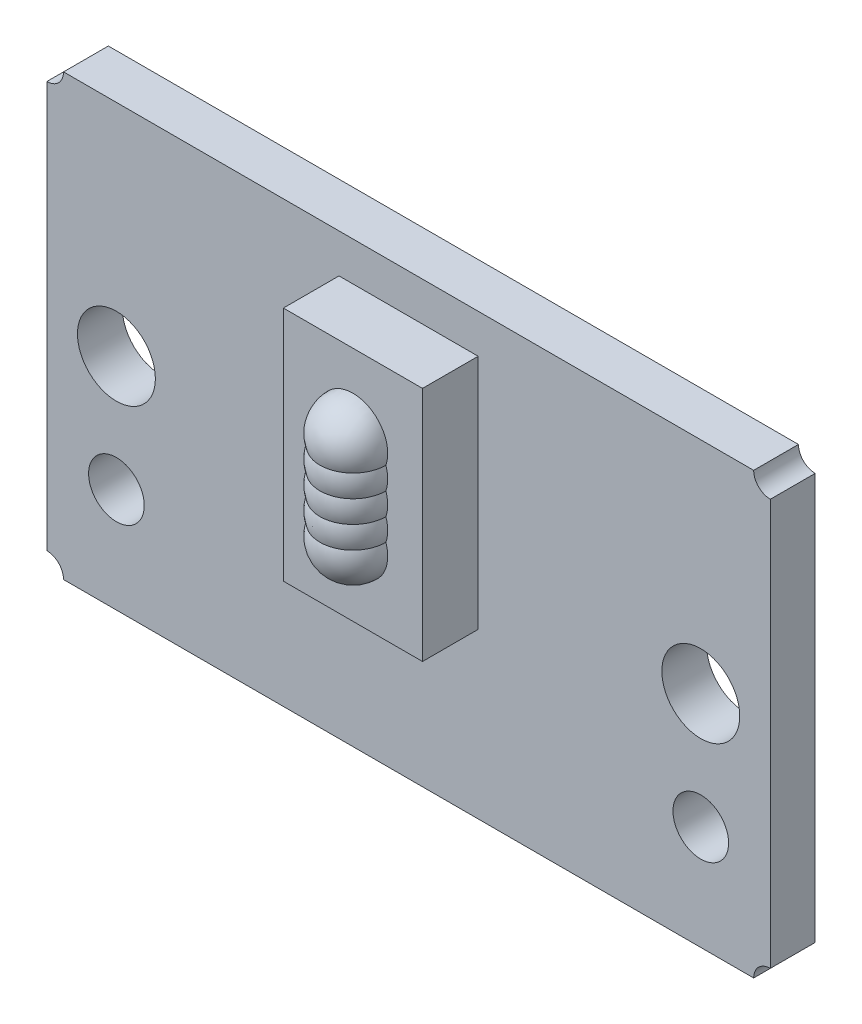
ISO-10303-21;
HEADER;
FILE_DESCRIPTION(('STEP AP214'),'2;1');
FILE_NAME('part.step','',(''),(''),'','','');
FILE_SCHEMA(('AUTOMOTIVE_DESIGN { 1 0 10303 214 1 1 1 1 }'));
ENDSEC;
DATA;
#1=APPLICATION_CONTEXT('core data for automotive mechanical design processes');
#2=APPLICATION_PROTOCOL_DEFINITION('international standard','automotive_design',2000,#1);
#3=PRODUCT_CONTEXT('',#1,'mechanical');
#4=PRODUCT('Part','Part','',(#3));
#5=PRODUCT_RELATED_PRODUCT_CATEGORY('part','',(#4));
#6=PRODUCT_DEFINITION_FORMATION('','',#4);
#7=PRODUCT_DEFINITION_CONTEXT('part definition',#1,'design');
#8=PRODUCT_DEFINITION('design','',#6,#7);
#9=PRODUCT_DEFINITION_SHAPE('','',#8);
#10=(LENGTH_UNIT() NAMED_UNIT(*) SI_UNIT(.MILLI.,.METRE.));
#11=(NAMED_UNIT(*) PLANE_ANGLE_UNIT() SI_UNIT($,.RADIAN.));
#12=(NAMED_UNIT(*) SI_UNIT($,.STERADIAN.) SOLID_ANGLE_UNIT());
#13=UNCERTAINTY_MEASURE_WITH_UNIT(LENGTH_MEASURE(1.E-05),#10,'distance_accuracy_value','');
#14=(GEOMETRIC_REPRESENTATION_CONTEXT(3) GLOBAL_UNCERTAINTY_ASSIGNED_CONTEXT((#13)) GLOBAL_UNIT_ASSIGNED_CONTEXT((#10,
#11,#12)) REPRESENTATION_CONTEXT('',''));
#15=CARTESIAN_POINT('',(0.,0.,0.));
#16=DIRECTION('',(0.,0.,1.));
#17=DIRECTION('',(1.,0.,0.));
#18=AXIS2_PLACEMENT_3D('',#15,#16,#17);
#19=CARTESIAN_POINT('',(0.,0.,1.61));
#20=DIRECTION('',(0.,0.,1.));
#21=DIRECTION('',(1.,0.,0.));
#22=AXIS2_PLACEMENT_3D('',#19,#20,#21);
#23=PLANE('',#22);
#24=CARTESIAN_POINT('',(10.5,0.,1.61));
#25=DIRECTION('',(0.,0.,1.));
#26=DIRECTION('',(1.,0.,0.));
#27=AXIS2_PLACEMENT_3D('',#24,#25,#26);
#28=CIRCLE('',#27,1.4);
#29=CARTESIAN_POINT('',(11.9,0.,1.61));
#30=VERTEX_POINT('',#29);
#31=EDGE_CURVE('E313',#30,#30,#28,.T.);
#32=ORIENTED_EDGE('',*,*,#31,.F.);
#33=EDGE_LOOP('',(#32));
#34=FACE_BOUND('',#33,.T.);
#35=CARTESIAN_POINT('',(-10.5,-4.15,1.61));
#36=DIRECTION('',(0.,0.,1.));
#37=DIRECTION('',(1.,0.,0.));
#38=AXIS2_PLACEMENT_3D('',#35,#36,#37);
#39=CIRCLE('',#38,1.);
#40=CARTESIAN_POINT('',(-9.5,-4.15,1.61));
#41=VERTEX_POINT('',#40);
#42=EDGE_CURVE('E312',#41,#41,#39,.T.);
#43=ORIENTED_EDGE('',*,*,#42,.F.);
#44=EDGE_LOOP('',(#43));
#45=FACE_BOUND('',#44,.T.);
#46=CARTESIAN_POINT('',(10.5,-4.15,1.61));
#47=DIRECTION('',(0.,0.,1.));
#48=DIRECTION('',(1.,0.,0.));
#49=AXIS2_PLACEMENT_3D('',#46,#47,#48);
#50=CIRCLE('',#49,1.);
#51=CARTESIAN_POINT('',(11.5,-4.15,1.61));
#52=VERTEX_POINT('',#51);
#53=EDGE_CURVE('E309',#52,#52,#50,.T.);
#54=ORIENTED_EDGE('',*,*,#53,.F.);
#55=EDGE_LOOP('',(#54));
#56=FACE_BOUND('',#55,.T.);
#57=CARTESIAN_POINT('',(-10.5,0.,1.61));
#58=DIRECTION('',(0.,0.,1.));
#59=DIRECTION('',(1.,0.,0.));
#60=AXIS2_PLACEMENT_3D('',#57,#58,#59);
#61=CIRCLE('',#60,1.4);
#62=CARTESIAN_POINT('',(-9.1,0.,1.61));
#63=VERTEX_POINT('',#62);
#64=EDGE_CURVE('E250',#63,#63,#61,.T.);
#65=ORIENTED_EDGE('',*,*,#64,.F.);
#66=EDGE_LOOP('',(#65));
#67=FACE_BOUND('',#66,.T.);
#68=CARTESIAN_POINT('',(13.,7.9,1.61));
#69=DIRECTION('',(0.,0.,1.));
#70=DIRECTION('',(1.,0.,0.));
#71=AXIS2_PLACEMENT_3D('',#68,#69,#70);
#72=CIRCLE('',#71,0.6);
#73=CARTESIAN_POINT('',(12.4,7.9,1.61));
#74=VERTEX_POINT('',#73);
#75=CARTESIAN_POINT('',(13.,7.3,1.61));
#76=VERTEX_POINT('',#75);
#77=EDGE_CURVE('E331',#74,#76,#72,.T.);
#78=ORIENTED_EDGE('',*,*,#77,.F.);
#79=DIRECTION('',(-1.,0.,0.));
#80=VECTOR('',#79,1.);
#81=CARTESIAN_POINT('',(-13.,7.9,1.61));
#82=LINE('',#81,#80);
#83=CARTESIAN_POINT('',(-12.4,7.9,1.61));
#84=VERTEX_POINT('',#83);
#85=EDGE_CURVE('E210',#74,#84,#82,.T.);
#86=ORIENTED_EDGE('',*,*,#85,.T.);
#87=CARTESIAN_POINT('',(-13.,7.9,1.61));
#88=DIRECTION('',(0.,0.,1.));
#89=DIRECTION('',(1.,0.,0.));
#90=AXIS2_PLACEMENT_3D('',#87,#88,#89);
#91=CIRCLE('',#90,0.6);
#92=CARTESIAN_POINT('',(-13.,7.3,1.61));
#93=VERTEX_POINT('',#92);
#94=EDGE_CURVE('E322',#93,#84,#91,.T.);
#95=ORIENTED_EDGE('',*,*,#94,.F.);
#96=DIRECTION('',(0.,-1.,0.));
#97=VECTOR('',#96,1.);
#98=CARTESIAN_POINT('',(-13.,7.9,1.61));
#99=LINE('',#98,#97);
#100=CARTESIAN_POINT('',(-13.,-7.3,1.61));
#101=VERTEX_POINT('',#100);
#102=EDGE_CURVE('E218',#93,#101,#99,.T.);
#103=ORIENTED_EDGE('',*,*,#102,.T.);
#104=CARTESIAN_POINT('',(-13.,-7.9,1.61));
#105=DIRECTION('',(0.,0.,1.));
#106=DIRECTION('',(1.,0.,0.));
#107=AXIS2_PLACEMENT_3D('',#104,#105,#106);
#108=CIRCLE('',#107,0.6);
#109=CARTESIAN_POINT('',(-12.4,-7.9,1.61));
#110=VERTEX_POINT('',#109);
#111=EDGE_CURVE('E320',#110,#101,#108,.T.);
#112=ORIENTED_EDGE('',*,*,#111,.F.);
#113=DIRECTION('',(1.,0.,0.));
#114=VECTOR('',#113,1.);
#115=CARTESIAN_POINT('',(-13.,-7.9,1.61));
#116=LINE('',#115,#114);
#117=CARTESIAN_POINT('',(12.4,-7.9,1.61));
#118=VERTEX_POINT('',#117);
#119=EDGE_CURVE('E222',#110,#118,#116,.T.);
#120=ORIENTED_EDGE('',*,*,#119,.T.);
#121=CARTESIAN_POINT('',(13.,-7.9,1.61));
#122=DIRECTION('',(0.,0.,1.));
#123=DIRECTION('',(1.,0.,0.));
#124=AXIS2_PLACEMENT_3D('',#121,#122,#123);
#125=CIRCLE('',#124,0.6);
#126=CARTESIAN_POINT('',(13.,-7.3,1.61));
#127=VERTEX_POINT('',#126);
#128=EDGE_CURVE('E326',#127,#118,#125,.T.);
#129=ORIENTED_EDGE('',*,*,#128,.F.);
#130=DIRECTION('',(0.,1.,0.));
#131=VECTOR('',#130,1.);
#132=CARTESIAN_POINT('',(13.,7.9,1.61));
#133=LINE('',#132,#131);
#134=EDGE_CURVE('E219',#127,#76,#133,.T.);
#135=ORIENTED_EDGE('',*,*,#134,.T.);
#136=EDGE_LOOP('',(#78,#86,#95,#103,#112,#120,#129,#135));
#137=FACE_BOUND('',#136,.T.);
#138=DIRECTION('',(-1.,0.,0.));
#139=VECTOR('',#138,1.);
#140=CARTESIAN_POINT('',(-2.5,6.5,1.61));
#141=LINE('',#140,#139);
#142=CARTESIAN_POINT('',(2.5,6.5,1.61));
#143=VERTEX_POINT('',#142);
#144=CARTESIAN_POINT('',(-2.5,6.5,1.61));
#145=VERTEX_POINT('',#144);
#146=EDGE_CURVE('E294',#143,#145,#141,.T.);
#147=ORIENTED_EDGE('',*,*,#146,.F.);
#148=DIRECTION('',(0.,1.,0.));
#149=VECTOR('',#148,1.);
#150=CARTESIAN_POINT('',(2.5,6.5,1.61));
#151=LINE('',#150,#149);
#152=CARTESIAN_POINT('',(2.5,-2.,1.61));
#153=VERTEX_POINT('',#152);
#154=EDGE_CURVE('E278',#153,#143,#151,.T.);
#155=ORIENTED_EDGE('',*,*,#154,.F.);
#156=DIRECTION('',(1.,0.,0.));
#157=VECTOR('',#156,1.);
#158=CARTESIAN_POINT('',(-2.5,-2.,1.61));
#159=LINE('',#158,#157);
#160=CARTESIAN_POINT('',(-2.5,-2.,1.61));
#161=VERTEX_POINT('',#160);
#162=EDGE_CURVE('E285',#161,#153,#159,.T.);
#163=ORIENTED_EDGE('',*,*,#162,.F.);
#164=DIRECTION('',(0.,-1.,0.));
#165=VECTOR('',#164,1.);
#166=CARTESIAN_POINT('',(-2.5,6.5,1.61));
#167=LINE('',#166,#165);
#168=EDGE_CURVE('E296',#145,#161,#167,.T.);
#169=ORIENTED_EDGE('',*,*,#168,.F.);
#170=EDGE_LOOP('',(#147,#155,#163,#169));
#171=FACE_BOUND('',#170,.T.);
#172=ADVANCED_FACE('F45',(#34,#45,#56,#67,#137,#171),#23,.T.);
#173=CARTESIAN_POINT('',(13.,7.9,1.61));
#174=DIRECTION('',(-1.,0.,0.));
#175=DIRECTION('',(0.,-1.,0.));
#176=AXIS2_PLACEMENT_3D('',#173,#174,#175);
#177=PLANE('',#176);
#178=DIRECTION('',(0.,1.,0.));
#179=VECTOR('',#178,1.);
#180=CARTESIAN_POINT('',(13.,7.9,0.));
#181=LINE('',#180,#179);
#182=CARTESIAN_POINT('',(13.,-7.3,0.));
#183=VERTEX_POINT('',#182);
#184=CARTESIAN_POINT('',(13.,7.3,0.));
#185=VERTEX_POINT('',#184);
#186=EDGE_CURVE('E232',#183,#185,#181,.T.);
#187=ORIENTED_EDGE('',*,*,#186,.T.);
#188=DIRECTION('',(0.,0.,1.));
#189=VECTOR('',#188,1.);
#190=CARTESIAN_POINT('',(13.,7.3,0.));
#191=LINE('',#190,#189);
#192=EDGE_CURVE('E236',#185,#76,#191,.T.);
#193=ORIENTED_EDGE('',*,*,#192,.T.);
#194=ORIENTED_EDGE('',*,*,#134,.F.);
#195=DIRECTION('',(0.,0.,1.));
#196=VECTOR('',#195,1.);
#197=CARTESIAN_POINT('',(13.,-7.3,0.));
#198=LINE('',#197,#196);
#199=EDGE_CURVE('E349',#127,#183,#198,.F.);
#200=ORIENTED_EDGE('',*,*,#199,.T.);
#201=EDGE_LOOP('',(#187,#193,#194,#200));
#202=FACE_BOUND('',#201,.T.);
#203=ADVANCED_FACE('F47',(#202),#177,.F.);
#204=CARTESIAN_POINT('',(-13.,7.9,1.61));
#205=DIRECTION('',(0.,-1.,0.));
#206=DIRECTION('',(0.,0.,-1.));
#207=AXIS2_PLACEMENT_3D('',#204,#205,#206);
#208=PLANE('',#207);
#209=ORIENTED_EDGE('',*,*,#85,.F.);
#210=DIRECTION('',(0.,0.,1.));
#211=VECTOR('',#210,1.);
#212=CARTESIAN_POINT('',(12.4,7.9,0.));
#213=LINE('',#212,#211);
#214=CARTESIAN_POINT('',(12.4,7.9,0.));
#215=VERTEX_POINT('',#214);
#216=EDGE_CURVE('E212',#74,#215,#213,.F.);
#217=ORIENTED_EDGE('',*,*,#216,.T.);
#218=DIRECTION('',(-1.,0.,0.));
#219=VECTOR('',#218,1.);
#220=CARTESIAN_POINT('',(-13.,7.9,0.));
#221=LINE('',#220,#219);
#222=CARTESIAN_POINT('',(-12.4,7.9,0.));
#223=VERTEX_POINT('',#222);
#224=EDGE_CURVE('E235',#215,#223,#221,.T.);
#225=ORIENTED_EDGE('',*,*,#224,.T.);
#226=DIRECTION('',(0.,0.,1.));
#227=VECTOR('',#226,1.);
#228=CARTESIAN_POINT('',(-12.4,7.9,0.));
#229=LINE('',#228,#227);
#230=EDGE_CURVE('E214',#223,#84,#229,.T.);
#231=ORIENTED_EDGE('',*,*,#230,.T.);
#232=EDGE_LOOP('',(#209,#217,#225,#231));
#233=FACE_BOUND('',#232,.T.);
#234=ADVANCED_FACE('F183',(#233),#208,.F.);
#235=CARTESIAN_POINT('',(-13.,7.9,1.61));
#236=DIRECTION('',(1.,0.,0.));
#237=DIRECTION('',(0.,1.,0.));
#238=AXIS2_PLACEMENT_3D('',#235,#236,#237);
#239=PLANE('',#238);
#240=DIRECTION('',(0.,-1.,0.));
#241=VECTOR('',#240,1.);
#242=CARTESIAN_POINT('',(-13.,7.9,0.));
#243=LINE('',#242,#241);
#244=CARTESIAN_POINT('',(-13.,7.3,0.));
#245=VERTEX_POINT('',#244);
#246=CARTESIAN_POINT('',(-13.,-7.3,0.));
#247=VERTEX_POINT('',#246);
#248=EDGE_CURVE('E238',#245,#247,#243,.T.);
#249=ORIENTED_EDGE('',*,*,#248,.T.);
#250=DIRECTION('',(0.,0.,1.));
#251=VECTOR('',#250,1.);
#252=CARTESIAN_POINT('',(-13.,-7.3,0.));
#253=LINE('',#252,#251);
#254=EDGE_CURVE('E343',#247,#101,#253,.T.);
#255=ORIENTED_EDGE('',*,*,#254,.T.);
#256=ORIENTED_EDGE('',*,*,#102,.F.);
#257=DIRECTION('',(0.,0.,1.));
#258=VECTOR('',#257,1.);
#259=CARTESIAN_POINT('',(-13.,7.3,0.));
#260=LINE('',#259,#258);
#261=EDGE_CURVE('E336',#93,#245,#260,.F.);
#262=ORIENTED_EDGE('',*,*,#261,.T.);
#263=EDGE_LOOP('',(#249,#255,#256,#262));
#264=FACE_BOUND('',#263,.T.);
#265=ADVANCED_FACE('F198',(#264),#239,.F.);
#266=CARTESIAN_POINT('',(-13.,-7.9,1.61));
#267=DIRECTION('',(0.,1.,0.));
#268=DIRECTION('',(0.,0.,1.));
#269=AXIS2_PLACEMENT_3D('',#266,#267,#268);
#270=PLANE('',#269);
#271=DIRECTION('',(1.,0.,0.));
#272=VECTOR('',#271,1.);
#273=CARTESIAN_POINT('',(-13.,-7.9,0.));
#274=LINE('',#273,#272);
#275=CARTESIAN_POINT('',(-12.4,-7.9,0.));
#276=VERTEX_POINT('',#275);
#277=CARTESIAN_POINT('',(12.4,-7.9,0.));
#278=VERTEX_POINT('',#277);
#279=EDGE_CURVE('E225',#276,#278,#274,.T.);
#280=ORIENTED_EDGE('',*,*,#279,.T.);
#281=DIRECTION('',(0.,0.,1.));
#282=VECTOR('',#281,1.);
#283=CARTESIAN_POINT('',(12.4,-7.9,0.));
#284=LINE('',#283,#282);
#285=EDGE_CURVE('E346',#278,#118,#284,.T.);
#286=ORIENTED_EDGE('',*,*,#285,.T.);
#287=ORIENTED_EDGE('',*,*,#119,.F.);
#288=DIRECTION('',(0.,0.,1.));
#289=VECTOR('',#288,1.);
#290=CARTESIAN_POINT('',(-12.4,-7.9,0.));
#291=LINE('',#290,#289);
#292=EDGE_CURVE('E340',#110,#276,#291,.F.);
#293=ORIENTED_EDGE('',*,*,#292,.T.);
#294=EDGE_LOOP('',(#280,#286,#287,#293));
#295=FACE_BOUND('',#294,.T.);
#296=ADVANCED_FACE('F194',(#295),#270,.F.);
#297=CARTESIAN_POINT('',(0.,0.,0.));
#298=DIRECTION('',(0.,0.,1.));
#299=DIRECTION('',(1.,0.,0.));
#300=AXIS2_PLACEMENT_3D('',#297,#298,#299);
#301=PLANE('',#300);
#302=CARTESIAN_POINT('',(10.5,0.,0.));
#303=DIRECTION('',(0.,0.,1.));
#304=DIRECTION('',(1.,0.,0.));
#305=AXIS2_PLACEMENT_3D('',#302,#303,#304);
#306=CIRCLE('',#305,1.4);
#307=CARTESIAN_POINT('',(11.9,0.,0.));
#308=VERTEX_POINT('',#307);
#309=EDGE_CURVE('E256',#308,#308,#306,.T.);
#310=ORIENTED_EDGE('',*,*,#309,.T.);
#311=EDGE_LOOP('',(#310));
#312=FACE_BOUND('',#311,.T.);
#313=CARTESIAN_POINT('',(-10.5,-4.15,0.));
#314=DIRECTION('',(0.,0.,1.));
#315=DIRECTION('',(1.,0.,0.));
#316=AXIS2_PLACEMENT_3D('',#313,#314,#315);
#317=CIRCLE('',#316,1.);
#318=CARTESIAN_POINT('',(-9.5,-4.15,0.));
#319=VERTEX_POINT('',#318);
#320=EDGE_CURVE('E253',#319,#319,#317,.T.);
#321=ORIENTED_EDGE('',*,*,#320,.T.);
#322=EDGE_LOOP('',(#321));
#323=FACE_BOUND('',#322,.T.);
#324=CARTESIAN_POINT('',(10.5,-4.15,0.));
#325=DIRECTION('',(0.,0.,1.));
#326=DIRECTION('',(1.,0.,0.));
#327=AXIS2_PLACEMENT_3D('',#324,#325,#326);
#328=CIRCLE('',#327,1.);
#329=CARTESIAN_POINT('',(11.5,-4.15,0.));
#330=VERTEX_POINT('',#329);
#331=EDGE_CURVE('E249',#330,#330,#328,.T.);
#332=ORIENTED_EDGE('',*,*,#331,.T.);
#333=EDGE_LOOP('',(#332));
#334=FACE_BOUND('',#333,.T.);
#335=CARTESIAN_POINT('',(-10.5,0.,0.));
#336=DIRECTION('',(0.,0.,1.));
#337=DIRECTION('',(1.,0.,0.));
#338=AXIS2_PLACEMENT_3D('',#335,#336,#337);
#339=CIRCLE('',#338,1.4);
#340=CARTESIAN_POINT('',(-9.1,0.,0.));
#341=VERTEX_POINT('',#340);
#342=EDGE_CURVE('E246',#341,#341,#339,.T.);
#343=ORIENTED_EDGE('',*,*,#342,.T.);
#344=EDGE_LOOP('',(#343));
#345=FACE_BOUND('',#344,.T.);
#346=ORIENTED_EDGE('',*,*,#224,.F.);
#347=CARTESIAN_POINT('',(13.,7.9,0.));
#348=DIRECTION('',(0.,0.,1.));
#349=DIRECTION('',(1.,0.,0.));
#350=AXIS2_PLACEMENT_3D('',#347,#348,#349);
#351=CIRCLE('',#350,0.6);
#352=EDGE_CURVE('E259',#215,#185,#351,.T.);
#353=ORIENTED_EDGE('',*,*,#352,.T.);
#354=ORIENTED_EDGE('',*,*,#186,.F.);
#355=CARTESIAN_POINT('',(13.,-7.9,0.));
#356=DIRECTION('',(0.,0.,1.));
#357=DIRECTION('',(1.,0.,0.));
#358=AXIS2_PLACEMENT_3D('',#355,#356,#357);
#359=CIRCLE('',#358,0.6);
#360=EDGE_CURVE('E328',#183,#278,#359,.T.);
#361=ORIENTED_EDGE('',*,*,#360,.T.);
#362=ORIENTED_EDGE('',*,*,#279,.F.);
#363=CARTESIAN_POINT('',(-13.,-7.9,0.));
#364=DIRECTION('',(0.,0.,1.));
#365=DIRECTION('',(1.,0.,0.));
#366=AXIS2_PLACEMENT_3D('',#363,#364,#365);
#367=CIRCLE('',#366,0.6);
#368=EDGE_CURVE('E323',#276,#247,#367,.T.);
#369=ORIENTED_EDGE('',*,*,#368,.T.);
#370=ORIENTED_EDGE('',*,*,#248,.F.);
#371=CARTESIAN_POINT('',(-13.,7.9,0.));
#372=DIRECTION('',(0.,0.,1.));
#373=DIRECTION('',(1.,0.,0.));
#374=AXIS2_PLACEMENT_3D('',#371,#372,#373);
#375=CIRCLE('',#374,0.6);
#376=EDGE_CURVE('E231',#245,#223,#375,.T.);
#377=ORIENTED_EDGE('',*,*,#376,.T.);
#378=EDGE_LOOP('',(#346,#353,#354,#361,#362,#369,#370,#377));
#379=FACE_BOUND('',#378,.T.);
#380=ADVANCED_FACE('F191',(#312,#323,#334,#345,#379),#301,.F.);
#381=CARTESIAN_POINT('',(-13.,7.9,0.));
#382=DIRECTION('',(0.,0.,1.));
#383=DIRECTION('',(1.,0.,0.));
#384=AXIS2_PLACEMENT_3D('',#381,#382,#383);
#385=CYLINDRICAL_SURFACE('',#384,0.6);
#386=ORIENTED_EDGE('',*,*,#376,.F.);
#387=ORIENTED_EDGE('',*,*,#261,.F.);
#388=ORIENTED_EDGE('',*,*,#94,.T.);
#389=ORIENTED_EDGE('',*,*,#230,.F.);
#390=EDGE_LOOP('',(#386,#387,#388,#389));
#391=FACE_BOUND('',#390,.T.);
#392=ADVANCED_FACE('F189',(#391),#385,.F.);
#393=CARTESIAN_POINT('',(-13.,-7.9,0.));
#394=DIRECTION('',(0.,0.,1.));
#395=DIRECTION('',(1.,0.,0.));
#396=AXIS2_PLACEMENT_3D('',#393,#394,#395);
#397=CYLINDRICAL_SURFACE('',#396,0.6);
#398=ORIENTED_EDGE('',*,*,#368,.F.);
#399=ORIENTED_EDGE('',*,*,#292,.F.);
#400=ORIENTED_EDGE('',*,*,#111,.T.);
#401=ORIENTED_EDGE('',*,*,#254,.F.);
#402=EDGE_LOOP('',(#398,#399,#400,#401));
#403=FACE_BOUND('',#402,.T.);
#404=ADVANCED_FACE('F375',(#403),#397,.F.);
#405=CARTESIAN_POINT('',(13.,-7.9,0.));
#406=DIRECTION('',(0.,0.,1.));
#407=DIRECTION('',(1.,0.,0.));
#408=AXIS2_PLACEMENT_3D('',#405,#406,#407);
#409=CYLINDRICAL_SURFACE('',#408,0.6);
#410=ORIENTED_EDGE('',*,*,#128,.T.);
#411=ORIENTED_EDGE('',*,*,#285,.F.);
#412=ORIENTED_EDGE('',*,*,#360,.F.);
#413=ORIENTED_EDGE('',*,*,#199,.F.);
#414=EDGE_LOOP('',(#410,#411,#412,#413));
#415=FACE_BOUND('',#414,.T.);
#416=ADVANCED_FACE('F361',(#415),#409,.F.);
#417=CARTESIAN_POINT('',(13.,7.9,0.));
#418=DIRECTION('',(0.,0.,1.));
#419=DIRECTION('',(1.,0.,0.));
#420=AXIS2_PLACEMENT_3D('',#417,#418,#419);
#421=CYLINDRICAL_SURFACE('',#420,0.6);
#422=ORIENTED_EDGE('',*,*,#352,.F.);
#423=ORIENTED_EDGE('',*,*,#216,.F.);
#424=ORIENTED_EDGE('',*,*,#77,.T.);
#425=ORIENTED_EDGE('',*,*,#192,.F.);
#426=EDGE_LOOP('',(#422,#423,#424,#425));
#427=FACE_BOUND('',#426,.T.);
#428=ADVANCED_FACE('F365',(#427),#421,.F.);
#429=CARTESIAN_POINT('',(-10.5,0.,-10.));
#430=DIRECTION('',(0.,0.,1.));
#431=DIRECTION('',(1.,0.,0.));
#432=AXIS2_PLACEMENT_3D('',#429,#430,#431);
#433=CYLINDRICAL_SURFACE('',#432,1.4);
#434=ORIENTED_EDGE('',*,*,#64,.T.);
#435=EDGE_LOOP('',(#434));
#436=FACE_BOUND('',#435,.T.);
#437=ORIENTED_EDGE('',*,*,#342,.F.);
#438=EDGE_LOOP('',(#437));
#439=FACE_BOUND('',#438,.T.);
#440=ADVANCED_FACE('F367',(#436,#439),#433,.F.);
#441=CARTESIAN_POINT('',(10.5,-4.15,-10.));
#442=DIRECTION('',(0.,0.,1.));
#443=DIRECTION('',(1.,0.,0.));
#444=AXIS2_PLACEMENT_3D('',#441,#442,#443);
#445=CYLINDRICAL_SURFACE('',#444,1.);
#446=ORIENTED_EDGE('',*,*,#53,.T.);
#447=EDGE_LOOP('',(#446));
#448=FACE_BOUND('',#447,.T.);
#449=ORIENTED_EDGE('',*,*,#331,.F.);
#450=EDGE_LOOP('',(#449));
#451=FACE_BOUND('',#450,.T.);
#452=ADVANCED_FACE('F372',(#448,#451),#445,.F.);
#453=CARTESIAN_POINT('',(-10.5,-4.15,-10.));
#454=DIRECTION('',(0.,0.,1.));
#455=DIRECTION('',(1.,0.,0.));
#456=AXIS2_PLACEMENT_3D('',#453,#454,#455);
#457=CYLINDRICAL_SURFACE('',#456,1.);
#458=ORIENTED_EDGE('',*,*,#42,.T.);
#459=EDGE_LOOP('',(#458));
#460=FACE_BOUND('',#459,.T.);
#461=ORIENTED_EDGE('',*,*,#320,.F.);
#462=EDGE_LOOP('',(#461));
#463=FACE_BOUND('',#462,.T.);
#464=ADVANCED_FACE('F381',(#460,#463),#457,.F.);
#465=CARTESIAN_POINT('',(10.5,0.,-10.));
#466=DIRECTION('',(0.,0.,1.));
#467=DIRECTION('',(1.,0.,0.));
#468=AXIS2_PLACEMENT_3D('',#465,#466,#467);
#469=CYLINDRICAL_SURFACE('',#468,1.4);
#470=ORIENTED_EDGE('',*,*,#31,.T.);
#471=EDGE_LOOP('',(#470));
#472=FACE_BOUND('',#471,.T.);
#473=ORIENTED_EDGE('',*,*,#309,.F.);
#474=EDGE_LOOP('',(#473));
#475=FACE_BOUND('',#474,.T.);
#476=ADVANCED_FACE('F384',(#472,#475),#469,.F.);
#477=CARTESIAN_POINT('',(2.5,6.5,3.61));
#478=DIRECTION('',(-1.,0.,0.));
#479=DIRECTION('',(0.,-1.,0.));
#480=AXIS2_PLACEMENT_3D('',#477,#478,#479);
#481=PLANE('',#480);
#482=ORIENTED_EDGE('',*,*,#154,.T.);
#483=DIRECTION('',(0.,0.,-1.));
#484=VECTOR('',#483,1.);
#485=CARTESIAN_POINT('',(2.5,6.5,3.61));
#486=LINE('',#485,#484);
#487=CARTESIAN_POINT('',(2.5,6.5,3.61));
#488=VERTEX_POINT('',#487);
#489=EDGE_CURVE('E307',#488,#143,#486,.T.);
#490=ORIENTED_EDGE('',*,*,#489,.F.);
#491=DIRECTION('',(0.,1.,0.));
#492=VECTOR('',#491,1.);
#493=CARTESIAN_POINT('',(2.5,6.5,3.61));
#494=LINE('',#493,#492);
#495=CARTESIAN_POINT('',(2.5,-2.,3.61));
#496=VERTEX_POINT('',#495);
#497=EDGE_CURVE('E281',#496,#488,#494,.T.);
#498=ORIENTED_EDGE('',*,*,#497,.F.);
#499=DIRECTION('',(0.,0.,-1.));
#500=VECTOR('',#499,1.);
#501=CARTESIAN_POINT('',(2.5,-2.,3.61));
#502=LINE('',#501,#500);
#503=EDGE_CURVE('E291',#496,#153,#502,.T.);
#504=ORIENTED_EDGE('',*,*,#503,.T.);
#505=EDGE_LOOP('',(#482,#490,#498,#504));
#506=FACE_BOUND('',#505,.T.);
#507=ADVANCED_FACE('F387',(#506),#481,.F.);
#508=CARTESIAN_POINT('',(-2.5,6.5,3.61));
#509=DIRECTION('',(0.,-1.,0.));
#510=DIRECTION('',(0.,0.,-1.));
#511=AXIS2_PLACEMENT_3D('',#508,#509,#510);
#512=PLANE('',#511);
#513=ORIENTED_EDGE('',*,*,#146,.T.);
#514=DIRECTION('',(0.,0.,-1.));
#515=VECTOR('',#514,1.);
#516=CARTESIAN_POINT('',(-2.5,6.5,3.61));
#517=LINE('',#516,#515);
#518=CARTESIAN_POINT('',(-2.5,6.5,3.61));
#519=VERTEX_POINT('',#518);
#520=EDGE_CURVE('E304',#519,#145,#517,.T.);
#521=ORIENTED_EDGE('',*,*,#520,.F.);
#522=DIRECTION('',(-1.,0.,0.));
#523=VECTOR('',#522,1.);
#524=CARTESIAN_POINT('',(-2.5,6.5,3.61));
#525=LINE('',#524,#523);
#526=EDGE_CURVE('E284',#488,#519,#525,.T.);
#527=ORIENTED_EDGE('',*,*,#526,.F.);
#528=ORIENTED_EDGE('',*,*,#489,.T.);
#529=EDGE_LOOP('',(#513,#521,#527,#528));
#530=FACE_BOUND('',#529,.T.);
#531=ADVANCED_FACE('F394',(#530),#512,.F.);
#532=CARTESIAN_POINT('',(-2.5,6.5,3.61));
#533=DIRECTION('',(1.,0.,0.));
#534=DIRECTION('',(0.,1.,0.));
#535=AXIS2_PLACEMENT_3D('',#532,#533,#534);
#536=PLANE('',#535);
#537=ORIENTED_EDGE('',*,*,#168,.T.);
#538=DIRECTION('',(0.,0.,-1.));
#539=VECTOR('',#538,1.);
#540=CARTESIAN_POINT('',(-2.5,-2.,3.61));
#541=LINE('',#540,#539);
#542=CARTESIAN_POINT('',(-2.5,-2.,3.61));
#543=VERTEX_POINT('',#542);
#544=EDGE_CURVE('E302',#543,#161,#541,.T.);
#545=ORIENTED_EDGE('',*,*,#544,.F.);
#546=DIRECTION('',(0.,-1.,0.));
#547=VECTOR('',#546,1.);
#548=CARTESIAN_POINT('',(-2.5,6.5,3.61));
#549=LINE('',#548,#547);
#550=EDGE_CURVE('E287',#519,#543,#549,.T.);
#551=ORIENTED_EDGE('',*,*,#550,.F.);
#552=ORIENTED_EDGE('',*,*,#520,.T.);
#553=EDGE_LOOP('',(#537,#545,#551,#552));
#554=FACE_BOUND('',#553,.T.);
#555=ADVANCED_FACE('F398',(#554),#536,.F.);
#556=CARTESIAN_POINT('',(-2.5,-2.,3.61));
#557=DIRECTION('',(0.,1.,0.));
#558=DIRECTION('',(0.,0.,1.));
#559=AXIS2_PLACEMENT_3D('',#556,#557,#558);
#560=PLANE('',#559);
#561=ORIENTED_EDGE('',*,*,#162,.T.);
#562=ORIENTED_EDGE('',*,*,#503,.F.);
#563=DIRECTION('',(1.,0.,0.));
#564=VECTOR('',#563,1.);
#565=CARTESIAN_POINT('',(-2.5,-2.,3.61));
#566=LINE('',#565,#564);
#567=EDGE_CURVE('E289',#543,#496,#566,.T.);
#568=ORIENTED_EDGE('',*,*,#567,.F.);
#569=ORIENTED_EDGE('',*,*,#544,.T.);
#570=EDGE_LOOP('',(#561,#562,#568,#569));
#571=FACE_BOUND('',#570,.T.);
#572=ADVANCED_FACE('F402',(#571),#560,.F.);
#573=CARTESIAN_POINT('',(0.,0.,3.61));
#574=DIRECTION('',(0.,0.,1.));
#575=DIRECTION('',(1.,0.,0.));
#576=AXIS2_PLACEMENT_3D('',#573,#574,#575);
#577=PLANE('',#576);
#578=CARTESIAN_POINT('',(0.,0.649999999999998,3.61));
#579=DIRECTION('',(0.,0.,1.));
#580=DIRECTION('',(1.,0.,0.));
#581=AXIS2_PLACEMENT_3D('',#578,#579,#580);
#582=CIRCLE('',#581,1.25);
#583=CARTESIAN_POINT('',(-1.1842719282327,1.05,3.61));
#584=VERTEX_POINT('',#583);
#585=CARTESIAN_POINT('',(1.1842719282327,1.05,3.61));
#586=VERTEX_POINT('',#585);
#587=EDGE_CURVE('E161',#584,#586,#582,.T.);
#588=ORIENTED_EDGE('',*,*,#587,.F.);
#589=CARTESIAN_POINT('',(0.,1.45,3.61));
#590=DIRECTION('',(0.,0.,1.));
#591=DIRECTION('',(1.,0.,0.));
#592=AXIS2_PLACEMENT_3D('',#589,#590,#591);
#593=CIRCLE('',#592,1.25);
#594=CARTESIAN_POINT('',(-1.1842719282327,1.85,3.61));
#595=VERTEX_POINT('',#594);
#596=EDGE_CURVE('E153',#595,#584,#593,.T.);
#597=ORIENTED_EDGE('',*,*,#596,.F.);
#598=CARTESIAN_POINT('',(0.,2.25,3.61));
#599=DIRECTION('',(0.,0.,1.));
#600=DIRECTION('',(1.,0.,0.));
#601=AXIS2_PLACEMENT_3D('',#598,#599,#600);
#602=CIRCLE('',#601,1.25);
#603=CARTESIAN_POINT('',(-1.1842719282327,2.65,3.61));
#604=VERTEX_POINT('',#603);
#605=EDGE_CURVE('E260',#604,#595,#602,.T.);
#606=ORIENTED_EDGE('',*,*,#605,.F.);
#607=CARTESIAN_POINT('',(0.,3.05,3.61));
#608=DIRECTION('',(0.,0.,1.));
#609=DIRECTION('',(1.,0.,0.));
#610=AXIS2_PLACEMENT_3D('',#607,#608,#609);
#611=CIRCLE('',#610,1.25);
#612=CARTESIAN_POINT('',(-1.1842719282327,3.45,3.61));
#613=VERTEX_POINT('',#612);
#614=EDGE_CURVE('E273',#613,#604,#611,.T.);
#615=ORIENTED_EDGE('',*,*,#614,.F.);
#616=CARTESIAN_POINT('',(0.,3.85,3.61));
#617=DIRECTION('',(0.,0.,1.));
#618=DIRECTION('',(1.,0.,0.));
#619=AXIS2_PLACEMENT_3D('',#616,#617,#618);
#620=CIRCLE('',#619,1.25);
#621=CARTESIAN_POINT('',(1.1842719282327,3.45,3.61));
#622=VERTEX_POINT('',#621);
#623=EDGE_CURVE('E158',#622,#613,#620,.T.);
#624=ORIENTED_EDGE('',*,*,#623,.F.);
#625=CARTESIAN_POINT('',(1.1842719282327,2.65,3.61));
#626=VERTEX_POINT('',#625);
#627=EDGE_CURVE('E276',#626,#622,#611,.T.);
#628=ORIENTED_EDGE('',*,*,#627,.F.);
#629=CARTESIAN_POINT('',(1.1842719282327,1.85,3.61));
#630=VERTEX_POINT('',#629);
#631=EDGE_CURVE('E245',#630,#626,#602,.T.);
#632=ORIENTED_EDGE('',*,*,#631,.F.);
#633=EDGE_CURVE('E62',#586,#630,#593,.T.);
#634=ORIENTED_EDGE('',*,*,#633,.F.);
#635=EDGE_LOOP('',(#588,#597,#606,#615,#624,#628,#632,#634));
#636=FACE_BOUND('',#635,.T.);
#637=ORIENTED_EDGE('',*,*,#497,.T.);
#638=ORIENTED_EDGE('',*,*,#526,.T.);
#639=ORIENTED_EDGE('',*,*,#550,.T.);
#640=ORIENTED_EDGE('',*,*,#567,.T.);
#641=EDGE_LOOP('',(#637,#638,#639,#640));
#642=FACE_BOUND('',#641,.T.);
#643=ADVANCED_FACE('F162',(#636,#642),#577,.T.);
#644=CARTESIAN_POINT('',(0.,2.25,3.61));
#645=DIRECTION('',(1.,0.,0.));
#646=DIRECTION('',(0.,1.,0.));
#647=AXIS2_PLACEMENT_3D('',#644,#645,#646);
#648=SPHERICAL_SURFACE('',#647,1.25);
#649=CARTESIAN_POINT('',(0.,1.85,3.61));
#650=DIRECTION('',(0.,-1.,0.));
#651=DIRECTION('',(1.,0.,0.));
#652=AXIS2_PLACEMENT_3D('',#649,#650,#651);
#653=CIRCLE('',#652,1.1842719282327);
#654=EDGE_CURVE('E53',#630,#595,#653,.T.);
#655=ORIENTED_EDGE('',*,*,#654,.F.);
#656=ORIENTED_EDGE('',*,*,#631,.T.);
#657=CARTESIAN_POINT('',(0.,2.65,3.61));
#658=DIRECTION('',(0.,1.,0.));
#659=DIRECTION('',(-1.,0.,0.));
#660=AXIS2_PLACEMENT_3D('',#657,#658,#659);
#661=CIRCLE('',#660,1.1842719282327);
#662=EDGE_CURVE('E262',#604,#626,#661,.T.);
#663=ORIENTED_EDGE('',*,*,#662,.F.);
#664=ORIENTED_EDGE('',*,*,#605,.T.);
#665=EDGE_LOOP('',(#655,#656,#663,#664));
#666=FACE_BOUND('',#665,.T.);
#667=ADVANCED_FACE('F409',(#666),#648,.T.);
#668=CARTESIAN_POINT('',(0.,3.05,3.61));
#669=DIRECTION('',(1.,0.,0.));
#670=DIRECTION('',(0.,1.,0.));
#671=AXIS2_PLACEMENT_3D('',#668,#669,#670);
#672=SPHERICAL_SURFACE('',#671,1.25);
#673=CARTESIAN_POINT('',(0.,3.45,3.61));
#674=DIRECTION('',(0.,1.,0.));
#675=DIRECTION('',(-1.,0.,0.));
#676=AXIS2_PLACEMENT_3D('',#673,#674,#675);
#677=CIRCLE('',#676,1.1842719282327);
#678=EDGE_CURVE('E265',#613,#622,#677,.T.);
#679=ORIENTED_EDGE('',*,*,#678,.F.);
#680=ORIENTED_EDGE('',*,*,#614,.T.);
#681=ORIENTED_EDGE('',*,*,#662,.T.);
#682=ORIENTED_EDGE('',*,*,#627,.T.);
#683=EDGE_LOOP('',(#679,#680,#681,#682));
#684=FACE_BOUND('',#683,.T.);
#685=ADVANCED_FACE('F272',(#684),#672,.T.);
#686=CARTESIAN_POINT('',(0.,3.85,3.61));
#687=DIRECTION('',(1.,0.,0.));
#688=DIRECTION('',(0.,1.,0.));
#689=AXIS2_PLACEMENT_3D('',#686,#687,#688);
#690=SPHERICAL_SURFACE('',#689,1.25);
#691=ORIENTED_EDGE('',*,*,#678,.T.);
#692=ORIENTED_EDGE('',*,*,#623,.T.);
#693=EDGE_LOOP('',(#691,#692));
#694=FACE_BOUND('',#693,.T.);
#695=ADVANCED_FACE('F173',(#694),#690,.T.);
#696=CARTESIAN_POINT('',(0.,1.45,3.61));
#697=DIRECTION('',(1.,0.,0.));
#698=DIRECTION('',(0.,1.,0.));
#699=AXIS2_PLACEMENT_3D('',#696,#697,#698);
#700=SPHERICAL_SURFACE('',#699,1.25);
#701=CARTESIAN_POINT('',(0.,1.05,3.61));
#702=DIRECTION('',(0.,-1.,0.));
#703=DIRECTION('',(1.,0.,0.));
#704=AXIS2_PLACEMENT_3D('',#701,#702,#703);
#705=CIRCLE('',#704,1.1842719282327);
#706=EDGE_CURVE('E11',#586,#584,#705,.T.);
#707=ORIENTED_EDGE('',*,*,#706,.F.);
#708=ORIENTED_EDGE('',*,*,#633,.T.);
#709=ORIENTED_EDGE('',*,*,#654,.T.);
#710=ORIENTED_EDGE('',*,*,#596,.T.);
#711=EDGE_LOOP('',(#707,#708,#709,#710));
#712=FACE_BOUND('',#711,.T.);
#713=ADVANCED_FACE('F155',(#712),#700,.T.);
#714=CARTESIAN_POINT('',(0.,0.649999999999998,3.61));
#715=DIRECTION('',(1.,0.,0.));
#716=DIRECTION('',(0.,1.,0.));
#717=AXIS2_PLACEMENT_3D('',#714,#715,#716);
#718=SPHERICAL_SURFACE('',#717,1.25);
#719=ORIENTED_EDGE('',*,*,#706,.T.);
#720=ORIENTED_EDGE('',*,*,#587,.T.);
#721=EDGE_LOOP('',(#719,#720));
#722=FACE_BOUND('',#721,.T.);
#723=ADVANCED_FACE('F167',(#722),#718,.T.);
#724=CLOSED_SHELL('',(#172,#203,#234,#265,#296,#380,#392,#404,#416,#428,#440,#452,#464,#476,
#507,#531,#555,#572,#643,#667,#685,#695,#713,#723));
#725=MANIFOLD_SOLID_BREP('B2',#724);
#726=ADVANCED_BREP_SHAPE_REPRESENTATION('',(#18,#725),#14);
#727=SHAPE_DEFINITION_REPRESENTATION(#9,#726);
ENDSEC;
END-ISO-10303-21;
